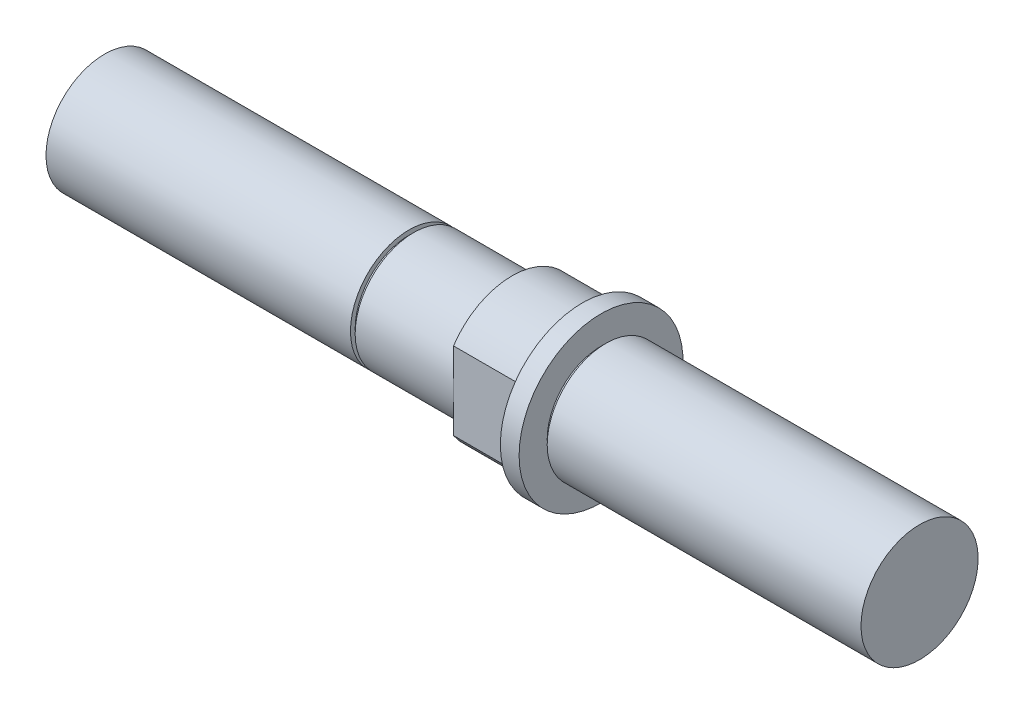
ISO-10303-21;
HEADER;
FILE_DESCRIPTION(('STEP AP214'),'2;1');
FILE_NAME('part.step','',(''),(''),'','','');
FILE_SCHEMA(('AUTOMOTIVE_DESIGN { 1 0 10303 214 1 1 1 1 }'));
ENDSEC;
DATA;
#1=APPLICATION_CONTEXT('core data for automotive mechanical design processes');
#2=APPLICATION_PROTOCOL_DEFINITION('international standard','automotive_design',2000,#1);
#3=PRODUCT_CONTEXT('',#1,'mechanical');
#4=PRODUCT('Part','Part','',(#3));
#5=PRODUCT_RELATED_PRODUCT_CATEGORY('part','',(#4));
#6=PRODUCT_DEFINITION_FORMATION('','',#4);
#7=PRODUCT_DEFINITION_CONTEXT('part definition',#1,'design');
#8=PRODUCT_DEFINITION('design','',#6,#7);
#9=PRODUCT_DEFINITION_SHAPE('','',#8);
#10=(LENGTH_UNIT() NAMED_UNIT(*) SI_UNIT(.MILLI.,.METRE.));
#11=(NAMED_UNIT(*) PLANE_ANGLE_UNIT() SI_UNIT($,.RADIAN.));
#12=(NAMED_UNIT(*) SI_UNIT($,.STERADIAN.) SOLID_ANGLE_UNIT());
#13=UNCERTAINTY_MEASURE_WITH_UNIT(LENGTH_MEASURE(1.E-05),#10,'distance_accuracy_value','');
#14=(GEOMETRIC_REPRESENTATION_CONTEXT(3) GLOBAL_UNCERTAINTY_ASSIGNED_CONTEXT((#13)) GLOBAL_UNIT_ASSIGNED_CONTEXT((#10,
#11,#12)) REPRESENTATION_CONTEXT('',''));
#15=CARTESIAN_POINT('',(0.,0.,0.));
#16=DIRECTION('',(0.,0.,1.));
#17=DIRECTION('',(1.,0.,0.));
#18=AXIS2_PLACEMENT_3D('',#15,#16,#17);
#19=CARTESIAN_POINT('',(-174.,0.,0.));
#20=DIRECTION('',(-1.,0.,0.));
#21=DIRECTION('',(0.,0.,1.));
#22=AXIS2_PLACEMENT_3D('',#19,#20,#21);
#23=CYLINDRICAL_SURFACE('',#22,15.);
#24=DIRECTION('',(-1.,0.,0.));
#25=VECTOR('',#24,1.);
#26=CARTESIAN_POINT('',(-17.6693753579635,8.29156197588849,12.5));
#27=LINE('',#26,#25);
#28=CARTESIAN_POINT('',(-72.,8.29156197588849,12.5));
#29=VERTEX_POINT('',#28);
#30=CARTESIAN_POINT('',(-87.,8.29156197588849,12.5));
#31=VERTEX_POINT('',#30);
#32=EDGE_CURVE('E115',#29,#31,#27,.T.);
#33=ORIENTED_EDGE('',*,*,#32,.F.);
#34=CARTESIAN_POINT('',(-72.,0.,0.));
#35=DIRECTION('',(-1.,0.,0.));
#36=DIRECTION('',(0.,0.,1.));
#37=AXIS2_PLACEMENT_3D('',#34,#35,#36);
#38=CIRCLE('',#37,15.);
#39=CARTESIAN_POINT('',(-72.,8.29156197588849,-12.5));
#40=VERTEX_POINT('',#39);
#41=EDGE_CURVE('E107',#29,#40,#38,.T.);
#42=ORIENTED_EDGE('',*,*,#41,.T.);
#43=DIRECTION('',(-1.,0.,0.));
#44=VECTOR('',#43,1.);
#45=CARTESIAN_POINT('',(-17.6693753579635,8.29156197588849,-12.5));
#46=LINE('',#45,#44);
#47=CARTESIAN_POINT('',(-87.,8.29156197588849,-12.5));
#48=VERTEX_POINT('',#47);
#49=EDGE_CURVE('E89',#40,#48,#46,.T.);
#50=ORIENTED_EDGE('',*,*,#49,.T.);
#51=CARTESIAN_POINT('',(-87.,0.,0.));
#52=DIRECTION('',(-1.,0.,0.));
#53=DIRECTION('',(0.,0.,1.));
#54=AXIS2_PLACEMENT_3D('',#51,#52,#53);
#55=CIRCLE('',#54,15.);
#56=EDGE_CURVE('E124',#31,#48,#55,.T.);
#57=ORIENTED_EDGE('',*,*,#56,.F.);
#58=EDGE_LOOP('',(#33,#42,#50,#57));
#59=FACE_BOUND('',#58,.T.);
#60=ADVANCED_FACE('F46',(#59),#23,.T.);
#61=DIRECTION('',(-1.,0.,0.));
#62=VECTOR('',#61,1.);
#63=CARTESIAN_POINT('',(-17.6693753579635,-8.29156197588849,12.5));
#64=LINE('',#63,#62);
#65=CARTESIAN_POINT('',(-72.,-8.29156197588849,12.5));
#66=VERTEX_POINT('',#65);
#67=CARTESIAN_POINT('',(-87.,-8.29156197588849,12.5));
#68=VERTEX_POINT('',#67);
#69=EDGE_CURVE('E227',#66,#68,#64,.T.);
#70=ORIENTED_EDGE('',*,*,#69,.T.);
#71=CARTESIAN_POINT('',(-87.,-8.29156197588849,-12.5));
#72=VERTEX_POINT('',#71);
#73=EDGE_CURVE('E208',#72,#68,#55,.T.);
#74=ORIENTED_EDGE('',*,*,#73,.F.);
#75=DIRECTION('',(-1.,0.,0.));
#76=VECTOR('',#75,1.);
#77=CARTESIAN_POINT('',(-17.6693753579635,-8.29156197588849,-12.5));
#78=LINE('',#77,#76);
#79=CARTESIAN_POINT('',(-72.,-8.29156197588849,-12.5));
#80=VERTEX_POINT('',#79);
#81=EDGE_CURVE('E100',#80,#72,#78,.T.);
#82=ORIENTED_EDGE('',*,*,#81,.F.);
#83=EDGE_CURVE('E109',#80,#66,#38,.T.);
#84=ORIENTED_EDGE('',*,*,#83,.T.);
#85=EDGE_LOOP('',(#70,#74,#82,#84));
#86=FACE_BOUND('',#85,.T.);
#87=ADVANCED_FACE('F152',(#86),#23,.T.);
#88=CARTESIAN_POINT('',(-87.,15.,0.));
#89=DIRECTION('',(1.,0.,0.));
#90=DIRECTION('',(0.,0.,-1.));
#91=AXIS2_PLACEMENT_3D('',#88,#89,#90);
#92=PLANE('',#91);
#93=DIRECTION('',(0.,-1.,0.));
#94=VECTOR('',#93,1.);
#95=CARTESIAN_POINT('',(-87.,15.,12.5));
#96=LINE('',#95,#94);
#97=CARTESIAN_POINT('',(-87.,0.,12.5));
#98=VERTEX_POINT('',#97);
#99=EDGE_CURVE('E12',#31,#98,#96,.T.);
#100=ORIENTED_EDGE('',*,*,#99,.F.);
#101=ORIENTED_EDGE('',*,*,#56,.T.);
#102=DIRECTION('',(0.,-1.,0.));
#103=VECTOR('',#102,1.);
#104=CARTESIAN_POINT('',(-87.,8.29156197588849,-12.5));
#105=LINE('',#104,#103);
#106=CARTESIAN_POINT('',(-87.,0.,-12.5));
#107=VERTEX_POINT('',#106);
#108=EDGE_CURVE('E94',#48,#107,#105,.T.);
#109=ORIENTED_EDGE('',*,*,#108,.T.);
#110=CARTESIAN_POINT('',(-87.,0.,0.));
#111=DIRECTION('',(-1.,0.,0.));
#112=DIRECTION('',(0.,0.,1.));
#113=AXIS2_PLACEMENT_3D('',#110,#111,#112);
#114=CIRCLE('',#113,12.5);
#115=EDGE_CURVE('E205',#98,#107,#114,.T.);
#116=ORIENTED_EDGE('',*,*,#115,.F.);
#117=EDGE_LOOP('',(#100,#101,#109,#116));
#118=FACE_BOUND('',#117,.T.);
#119=ADVANCED_FACE('F158',(#118),#92,.F.);
#120=DIRECTION('',(0.,1.,0.));
#121=VECTOR('',#120,1.);
#122=CARTESIAN_POINT('',(-87.,8.29156197588849,12.5));
#123=LINE('',#122,#121);
#124=EDGE_CURVE('E223',#68,#98,#123,.T.);
#125=ORIENTED_EDGE('',*,*,#124,.T.);
#126=EDGE_CURVE('E203',#107,#98,#114,.T.);
#127=ORIENTED_EDGE('',*,*,#126,.F.);
#128=DIRECTION('',(0.,1.,0.));
#129=VECTOR('',#128,1.);
#130=CARTESIAN_POINT('',(-87.,15.,-12.5));
#131=LINE('',#130,#129);
#132=EDGE_CURVE('E55',#72,#107,#131,.T.);
#133=ORIENTED_EDGE('',*,*,#132,.F.);
#134=ORIENTED_EDGE('',*,*,#73,.T.);
#135=EDGE_LOOP('',(#125,#127,#133,#134));
#136=FACE_BOUND('',#135,.T.);
#137=ADVANCED_FACE('F178',(#136),#92,.F.);
#138=CARTESIAN_POINT('',(-174.,0.,0.));
#139=DIRECTION('',(-1.,0.,0.));
#140=DIRECTION('',(0.,0.,1.));
#141=AXIS2_PLACEMENT_3D('',#138,#139,#140);
#142=CYLINDRICAL_SURFACE('',#141,12.5);
#143=ORIENTED_EDGE('',*,*,#115,.T.);
#144=ORIENTED_EDGE('',*,*,#126,.T.);
#145=EDGE_LOOP('',(#143,#144));
#146=FACE_BOUND('',#145,.T.);
#147=CARTESIAN_POINT('',(-108.,0.,0.));
#148=DIRECTION('',(-1.,0.,0.));
#149=DIRECTION('',(0.,0.,1.));
#150=AXIS2_PLACEMENT_3D('',#147,#148,#149);
#151=CIRCLE('',#150,12.5);
#152=CARTESIAN_POINT('',(-108.,0.,12.5));
#153=VERTEX_POINT('',#152);
#154=EDGE_CURVE('E204',#153,#153,#151,.T.);
#155=ORIENTED_EDGE('',*,*,#154,.F.);
#156=EDGE_LOOP('',(#155));
#157=FACE_BOUND('',#156,.T.);
#158=ADVANCED_FACE('F171',(#146,#157),#142,.T.);
#159=CARTESIAN_POINT('',(-68.,12.5,0.));
#160=DIRECTION('',(-1.,0.,0.));
#161=DIRECTION('',(0.,0.,1.));
#162=AXIS2_PLACEMENT_3D('',#159,#160,#161);
#163=PLANE('',#162);
#164=CARTESIAN_POINT('',(-68.,0.,0.));
#165=DIRECTION('',(-1.,0.,0.));
#166=DIRECTION('',(0.,0.,1.));
#167=AXIS2_PLACEMENT_3D('',#164,#165,#166);
#168=CIRCLE('',#167,17.5);
#169=CARTESIAN_POINT('',(-68.,0.,17.5));
#170=VERTEX_POINT('',#169);
#171=EDGE_CURVE('E122',#170,#170,#168,.T.);
#172=ORIENTED_EDGE('',*,*,#171,.F.);
#173=EDGE_LOOP('',(#172));
#174=FACE_BOUND('',#173,.T.);
#175=CARTESIAN_POINT('',(-68.,0.,0.));
#176=DIRECTION('',(-1.,0.,0.));
#177=DIRECTION('',(0.,0.,1.));
#178=AXIS2_PLACEMENT_3D('',#175,#176,#177);
#179=CIRCLE('',#178,11.5);
#180=CARTESIAN_POINT('',(-68.,0.,11.5));
#181=VERTEX_POINT('',#180);
#182=EDGE_CURVE('E185',#181,#181,#179,.T.);
#183=ORIENTED_EDGE('',*,*,#182,.T.);
#184=EDGE_LOOP('',(#183));
#185=FACE_BOUND('',#184,.T.);
#186=ADVANCED_FACE('F168',(#174,#185),#163,.F.);
#187=CARTESIAN_POINT('',(-174.,0.,0.));
#188=DIRECTION('',(-1.,0.,0.));
#189=DIRECTION('',(0.,0.,1.));
#190=AXIS2_PLACEMENT_3D('',#187,#188,#189);
#191=CYLINDRICAL_SURFACE('',#190,17.5);
#192=CARTESIAN_POINT('',(-72.,0.,0.));
#193=DIRECTION('',(-1.,0.,0.));
#194=DIRECTION('',(0.,0.,1.));
#195=AXIS2_PLACEMENT_3D('',#192,#193,#194);
#196=CIRCLE('',#195,17.5);
#197=CARTESIAN_POINT('',(-72.,0.,17.5));
#198=VERTEX_POINT('',#197);
#199=EDGE_CURVE('E117',#198,#198,#196,.T.);
#200=ORIENTED_EDGE('',*,*,#199,.F.);
#201=EDGE_LOOP('',(#200));
#202=FACE_BOUND('',#201,.T.);
#203=ORIENTED_EDGE('',*,*,#171,.T.);
#204=EDGE_LOOP('',(#203));
#205=FACE_BOUND('',#204,.T.);
#206=ADVANCED_FACE('F166',(#202,#205),#191,.T.);
#207=CARTESIAN_POINT('',(-72.,17.5,0.));
#208=DIRECTION('',(1.,0.,0.));
#209=DIRECTION('',(0.,0.,-1.));
#210=AXIS2_PLACEMENT_3D('',#207,#208,#209);
#211=PLANE('',#210);
#212=ORIENTED_EDGE('',*,*,#41,.F.);
#213=DIRECTION('',(0.,1.,0.));
#214=VECTOR('',#213,1.);
#215=CARTESIAN_POINT('',(-72.,8.29156197588849,12.5));
#216=LINE('',#215,#214);
#217=EDGE_CURVE('E112',#66,#29,#216,.T.);
#218=ORIENTED_EDGE('',*,*,#217,.F.);
#219=ORIENTED_EDGE('',*,*,#83,.F.);
#220=DIRECTION('',(0.,-1.,0.));
#221=VECTOR('',#220,1.);
#222=CARTESIAN_POINT('',(-72.,8.29156197588849,-12.5));
#223=LINE('',#222,#221);
#224=EDGE_CURVE('E92',#40,#80,#223,.T.);
#225=ORIENTED_EDGE('',*,*,#224,.F.);
#226=EDGE_LOOP('',(#212,#218,#219,#225));
#227=FACE_BOUND('',#226,.T.);
#228=ORIENTED_EDGE('',*,*,#199,.T.);
#229=EDGE_LOOP('',(#228));
#230=FACE_BOUND('',#229,.T.);
#231=ADVANCED_FACE('F105',(#227,#230),#211,.F.);
#232=CARTESIAN_POINT('',(-108.,12.5,0.));
#233=DIRECTION('',(-1.,0.,0.));
#234=DIRECTION('',(0.,0.,1.));
#235=AXIS2_PLACEMENT_3D('',#232,#233,#234);
#236=PLANE('',#235);
#237=ORIENTED_EDGE('',*,*,#154,.T.);
#238=EDGE_LOOP('',(#237));
#239=FACE_BOUND('',#238,.T.);
#240=CARTESIAN_POINT('',(-108.,0.,0.));
#241=DIRECTION('',(-1.,0.,0.));
#242=DIRECTION('',(0.,0.,1.));
#243=AXIS2_PLACEMENT_3D('',#240,#241,#242);
#244=CIRCLE('',#243,11.5);
#245=CARTESIAN_POINT('',(-108.,0.,11.5));
#246=VERTEX_POINT('',#245);
#247=EDGE_CURVE('E236',#246,#246,#244,.T.);
#248=ORIENTED_EDGE('',*,*,#247,.F.);
#249=EDGE_LOOP('',(#248));
#250=FACE_BOUND('',#249,.T.);
#251=ADVANCED_FACE('F165',(#239,#250),#236,.T.);
#252=CARTESIAN_POINT('',(-174.,0.,0.));
#253=DIRECTION('',(-1.,0.,0.));
#254=DIRECTION('',(0.,0.,1.));
#255=AXIS2_PLACEMENT_3D('',#252,#253,#254);
#256=CYLINDRICAL_SURFACE('',#255,11.5);
#257=ORIENTED_EDGE('',*,*,#247,.T.);
#258=EDGE_LOOP('',(#257));
#259=FACE_BOUND('',#258,.T.);
#260=CARTESIAN_POINT('',(-109.,0.,0.));
#261=DIRECTION('',(-1.,0.,0.));
#262=DIRECTION('',(0.,0.,1.));
#263=AXIS2_PLACEMENT_3D('',#260,#261,#262);
#264=CIRCLE('',#263,11.5);
#265=CARTESIAN_POINT('',(-109.,0.,11.5));
#266=VERTEX_POINT('',#265);
#267=EDGE_CURVE('E194',#266,#266,#264,.T.);
#268=ORIENTED_EDGE('',*,*,#267,.F.);
#269=EDGE_LOOP('',(#268));
#270=FACE_BOUND('',#269,.T.);
#271=ADVANCED_FACE('F254',(#259,#270),#256,.T.);
#272=CARTESIAN_POINT('',(-109.,11.5,0.));
#273=DIRECTION('',(1.,0.,0.));
#274=DIRECTION('',(0.,0.,-1.));
#275=AXIS2_PLACEMENT_3D('',#272,#273,#274);
#276=PLANE('',#275);
#277=ORIENTED_EDGE('',*,*,#267,.T.);
#278=EDGE_LOOP('',(#277));
#279=FACE_BOUND('',#278,.T.);
#280=CARTESIAN_POINT('',(-109.,0.,0.));
#281=DIRECTION('',(-1.,0.,0.));
#282=DIRECTION('',(0.,0.,1.));
#283=AXIS2_PLACEMENT_3D('',#280,#281,#282);
#284=CIRCLE('',#283,12.5);
#285=CARTESIAN_POINT('',(-109.,0.,12.5));
#286=VERTEX_POINT('',#285);
#287=EDGE_CURVE('E188',#286,#286,#284,.T.);
#288=ORIENTED_EDGE('',*,*,#287,.F.);
#289=EDGE_LOOP('',(#288));
#290=FACE_BOUND('',#289,.T.);
#291=ADVANCED_FACE('F249',(#279,#290),#276,.T.);
#292=CARTESIAN_POINT('',(-174.,0.,0.));
#293=DIRECTION('',(-1.,0.,0.));
#294=DIRECTION('',(0.,0.,1.));
#295=AXIS2_PLACEMENT_3D('',#292,#293,#294);
#296=CYLINDRICAL_SURFACE('',#295,11.5);
#297=CARTESIAN_POINT('',(-67.,0.,0.));
#298=DIRECTION('',(-1.,0.,0.));
#299=DIRECTION('',(0.,0.,1.));
#300=AXIS2_PLACEMENT_3D('',#297,#298,#299);
#301=CIRCLE('',#300,11.5);
#302=CARTESIAN_POINT('',(-67.,0.,11.5));
#303=VERTEX_POINT('',#302);
#304=EDGE_CURVE('E189',#303,#303,#301,.T.);
#305=ORIENTED_EDGE('',*,*,#304,.T.);
#306=EDGE_LOOP('',(#305));
#307=FACE_BOUND('',#306,.T.);
#308=ORIENTED_EDGE('',*,*,#182,.F.);
#309=EDGE_LOOP('',(#308));
#310=FACE_BOUND('',#309,.T.);
#311=ADVANCED_FACE('F148',(#307,#310),#296,.T.);
#312=CARTESIAN_POINT('',(-67.,11.5,0.));
#313=DIRECTION('',(-1.,0.,0.));
#314=DIRECTION('',(0.,0.,1.));
#315=AXIS2_PLACEMENT_3D('',#312,#313,#314);
#316=PLANE('',#315);
#317=CARTESIAN_POINT('',(-67.,0.,0.));
#318=DIRECTION('',(-1.,0.,0.));
#319=DIRECTION('',(0.,0.,1.));
#320=AXIS2_PLACEMENT_3D('',#317,#318,#319);
#321=CIRCLE('',#320,12.5);
#322=CARTESIAN_POINT('',(-67.,0.,12.5));
#323=VERTEX_POINT('',#322);
#324=EDGE_CURVE('E111',#323,#323,#321,.T.);
#325=ORIENTED_EDGE('',*,*,#324,.T.);
#326=EDGE_LOOP('',(#325));
#327=FACE_BOUND('',#326,.T.);
#328=ORIENTED_EDGE('',*,*,#304,.F.);
#329=EDGE_LOOP('',(#328));
#330=FACE_BOUND('',#329,.T.);
#331=ADVANCED_FACE('F141',(#327,#330),#316,.T.);
#332=CARTESIAN_POINT('',(0.,0.,0.));
#333=DIRECTION('',(-1.,0.,0.));
#334=DIRECTION('',(0.,0.,1.));
#335=AXIS2_PLACEMENT_3D('',#332,#333,#334);
#336=PLANE('',#335);
#337=CARTESIAN_POINT('',(0.,0.,0.));
#338=DIRECTION('',(-1.,0.,0.));
#339=DIRECTION('',(0.,0.,1.));
#340=AXIS2_PLACEMENT_3D('',#337,#338,#339);
#341=CIRCLE('',#340,12.5);
#342=CARTESIAN_POINT('',(0.,0.,12.5));
#343=VERTEX_POINT('',#342);
#344=EDGE_CURVE('E131',#343,#343,#341,.T.);
#345=ORIENTED_EDGE('',*,*,#344,.F.);
#346=EDGE_LOOP('',(#345));
#347=FACE_BOUND('',#346,.T.);
#348=ADVANCED_FACE('F48',(#347),#336,.F.);
#349=CARTESIAN_POINT('',(-174.,0.,0.));
#350=DIRECTION('',(-1.,0.,0.));
#351=DIRECTION('',(0.,0.,1.));
#352=AXIS2_PLACEMENT_3D('',#349,#350,#351);
#353=CYLINDRICAL_SURFACE('',#352,12.5);
#354=ORIENTED_EDGE('',*,*,#344,.T.);
#355=EDGE_LOOP('',(#354));
#356=FACE_BOUND('',#355,.T.);
#357=ORIENTED_EDGE('',*,*,#324,.F.);
#358=EDGE_LOOP('',(#357));
#359=FACE_BOUND('',#358,.T.);
#360=ADVANCED_FACE('F137',(#356,#359),#353,.T.);
#361=CARTESIAN_POINT('',(-174.,12.5,0.));
#362=DIRECTION('',(1.,0.,0.));
#363=DIRECTION('',(0.,0.,-1.));
#364=AXIS2_PLACEMENT_3D('',#361,#362,#363);
#365=PLANE('',#364);
#366=CARTESIAN_POINT('',(-174.,0.,0.));
#367=DIRECTION('',(-1.,0.,0.));
#368=DIRECTION('',(0.,0.,1.));
#369=AXIS2_PLACEMENT_3D('',#366,#367,#368);
#370=CIRCLE('',#369,12.5);
#371=CARTESIAN_POINT('',(-174.,0.,12.5));
#372=VERTEX_POINT('',#371);
#373=EDGE_CURVE('E200',#372,#372,#370,.T.);
#374=ORIENTED_EDGE('',*,*,#373,.T.);
#375=EDGE_LOOP('',(#374));
#376=FACE_BOUND('',#375,.T.);
#377=ADVANCED_FACE('F146',(#376),#365,.F.);
#378=ORIENTED_EDGE('',*,*,#373,.F.);
#379=EDGE_LOOP('',(#378));
#380=FACE_BOUND('',#379,.T.);
#381=ORIENTED_EDGE('',*,*,#287,.T.);
#382=EDGE_LOOP('',(#381));
#383=FACE_BOUND('',#382,.T.);
#384=ADVANCED_FACE('F180',(#380,#383),#142,.T.);
#385=CARTESIAN_POINT('',(-17.6693753579635,8.29156197588849,-12.5));
#386=DIRECTION('',(0.,0.,-1.));
#387=DIRECTION('',(0.,1.,0.));
#388=AXIS2_PLACEMENT_3D('',#385,#386,#387);
#389=PLANE('',#388);
#390=ORIENTED_EDGE('',*,*,#224,.T.);
#391=ORIENTED_EDGE('',*,*,#81,.T.);
#392=ORIENTED_EDGE('',*,*,#132,.T.);
#393=ORIENTED_EDGE('',*,*,#108,.F.);
#394=ORIENTED_EDGE('',*,*,#49,.F.);
#395=EDGE_LOOP('',(#390,#391,#392,#393,#394));
#396=FACE_BOUND('',#395,.T.);
#397=ADVANCED_FACE('F91',(#396),#389,.T.);
#398=CARTESIAN_POINT('',(-17.6693753579635,8.29156197588849,12.5));
#399=DIRECTION('',(0.,0.,1.));
#400=DIRECTION('',(1.,0.,0.));
#401=AXIS2_PLACEMENT_3D('',#398,#399,#400);
#402=PLANE('',#401);
#403=ORIENTED_EDGE('',*,*,#217,.T.);
#404=ORIENTED_EDGE('',*,*,#32,.T.);
#405=ORIENTED_EDGE('',*,*,#99,.T.);
#406=ORIENTED_EDGE('',*,*,#124,.F.);
#407=ORIENTED_EDGE('',*,*,#69,.F.);
#408=EDGE_LOOP('',(#403,#404,#405,#406,#407));
#409=FACE_BOUND('',#408,.T.);
#410=ADVANCED_FACE('F270',(#409),#402,.T.);
#411=CLOSED_SHELL('',(#60,#87,#119,#137,#158,#186,#206,#231,#251,#271,#291,#311,#331,#348,#360,
#377,#384,#397,#410));
#412=MANIFOLD_SOLID_BREP('B2',#411);
#413=ADVANCED_BREP_SHAPE_REPRESENTATION('',(#18,#412),#14);
#414=SHAPE_DEFINITION_REPRESENTATION(#9,#413);
ENDSEC;
END-ISO-10303-21;
